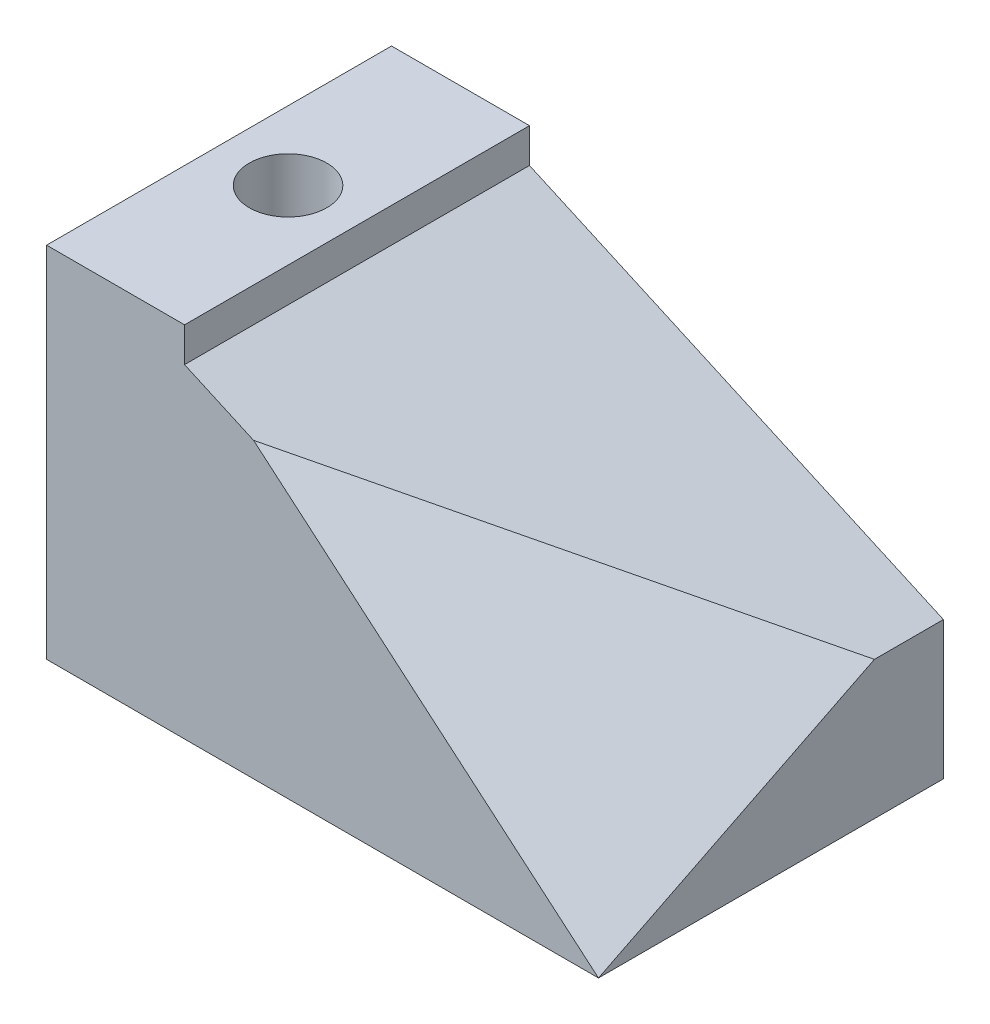
ISO-10303-21;
HEADER;
FILE_DESCRIPTION(('STEP AP214'),'2;1');
FILE_NAME('part.step','',(''),(''),'','','');
FILE_SCHEMA(('AUTOMOTIVE_DESIGN { 1 0 10303 214 1 1 1 1 }'));
ENDSEC;
DATA;
#1=APPLICATION_CONTEXT('core data for automotive mechanical design processes');
#2=APPLICATION_PROTOCOL_DEFINITION('international standard','automotive_design',2000,#1);
#3=PRODUCT_CONTEXT('',#1,'mechanical');
#4=PRODUCT('Part','Part','',(#3));
#5=PRODUCT_RELATED_PRODUCT_CATEGORY('part','',(#4));
#6=PRODUCT_DEFINITION_FORMATION('','',#4);
#7=PRODUCT_DEFINITION_CONTEXT('part definition',#1,'design');
#8=PRODUCT_DEFINITION('design','',#6,#7);
#9=PRODUCT_DEFINITION_SHAPE('','',#8);
#10=(LENGTH_UNIT() NAMED_UNIT(*) SI_UNIT(.MILLI.,.METRE.));
#11=(NAMED_UNIT(*) PLANE_ANGLE_UNIT() SI_UNIT($,.RADIAN.));
#12=(NAMED_UNIT(*) SI_UNIT($,.STERADIAN.) SOLID_ANGLE_UNIT());
#13=UNCERTAINTY_MEASURE_WITH_UNIT(LENGTH_MEASURE(1.E-05),#10,'distance_accuracy_value','');
#14=(GEOMETRIC_REPRESENTATION_CONTEXT(3) GLOBAL_UNCERTAINTY_ASSIGNED_CONTEXT((#13)) GLOBAL_UNIT_ASSIGNED_CONTEXT((#10,
#11,#12)) REPRESENTATION_CONTEXT('',''));
#15=CARTESIAN_POINT('',(0.,0.,0.));
#16=DIRECTION('',(0.,0.,1.));
#17=DIRECTION('',(1.,0.,0.));
#18=AXIS2_PLACEMENT_3D('',#15,#16,#17);
#19=CARTESIAN_POINT('',(400.,-260.,125.));
#20=DIRECTION('',(-1.,0.,0.));
#21=DIRECTION('',(0.,0.,1.));
#22=AXIS2_PLACEMENT_3D('',#19,#20,#21);
#23=PLANE('',#22);
#24=DIRECTION('',(0.,-0.447213595499958,0.894427190999916));
#25=VECTOR('',#24,1.);
#26=CARTESIAN_POINT('',(400.,-160.,-75.));
#27=LINE('',#26,#25);
#28=CARTESIAN_POINT('',(400.,-160.,-75.));
#29=VERTEX_POINT('',#28);
#30=CARTESIAN_POINT('',(400.,-260.,125.));
#31=VERTEX_POINT('',#30);
#32=EDGE_CURVE('E138',#29,#31,#27,.T.);
#33=ORIENTED_EDGE('',*,*,#32,.T.);
#34=DIRECTION('',(0.,0.,-1.));
#35=VECTOR('',#34,1.);
#36=CARTESIAN_POINT('',(400.,-260.,125.));
#37=LINE('',#36,#35);
#38=CARTESIAN_POINT('',(400.,-260.,-125.));
#39=VERTEX_POINT('',#38);
#40=EDGE_CURVE('E149',#31,#39,#37,.T.);
#41=ORIENTED_EDGE('',*,*,#40,.T.);
#42=DIRECTION('',(0.,1.,0.));
#43=VECTOR('',#42,1.);
#44=CARTESIAN_POINT('',(400.,-260.,-125.));
#45=LINE('',#44,#43);
#46=CARTESIAN_POINT('',(400.,-160.,-125.));
#47=VERTEX_POINT('',#46);
#48=EDGE_CURVE('E190',#39,#47,#45,.T.);
#49=ORIENTED_EDGE('',*,*,#48,.T.);
#50=DIRECTION('',(0.,0.,-1.));
#51=VECTOR('',#50,1.);
#52=CARTESIAN_POINT('',(400.,-160.,125.));
#53=LINE('',#52,#51);
#54=EDGE_CURVE('E151',#29,#47,#53,.T.);
#55=ORIENTED_EDGE('',*,*,#54,.F.);
#56=EDGE_LOOP('',(#33,#41,#49,#55));
#57=FACE_BOUND('',#56,.T.);
#58=ADVANCED_FACE('F70',(#57),#23,.F.);
#59=CARTESIAN_POINT('',(400.,-160.,125.));
#60=DIRECTION('',(-0.410364677328798,-0.911921505175107,0.));
#61=DIRECTION('',(0.911921505175107,-0.410364677328798,0.));
#62=AXIS2_PLACEMENT_3D('',#59,#60,#61);
#63=PLANE('',#62);
#64=DIRECTION('',(0.736709468683757,-0.331519260907691,-0.589367574947006));
#65=VECTOR('',#64,1.);
#66=CARTESIAN_POINT('',(150.,-47.5,125.));
#67=LINE('',#66,#65);
#68=CARTESIAN_POINT('',(150.,-47.5,125.));
#69=VERTEX_POINT('',#68);
#70=EDGE_CURVE('E88',#69,#29,#67,.T.);
#71=ORIENTED_EDGE('',*,*,#70,.T.);
#72=ORIENTED_EDGE('',*,*,#54,.T.);
#73=DIRECTION('',(-0.911921505175106,0.410364677328798,0.));
#74=VECTOR('',#73,1.);
#75=CARTESIAN_POINT('',(400.,-160.,-125.));
#76=LINE('',#75,#74);
#77=CARTESIAN_POINT('',(100.,-25.,-125.));
#78=VERTEX_POINT('',#77);
#79=EDGE_CURVE('E187',#47,#78,#76,.T.);
#80=ORIENTED_EDGE('',*,*,#79,.T.);
#81=DIRECTION('',(0.,0.,-1.));
#82=VECTOR('',#81,1.);
#83=CARTESIAN_POINT('',(100.,-25.,125.));
#84=LINE('',#83,#82);
#85=CARTESIAN_POINT('',(100.,-25.,125.));
#86=VERTEX_POINT('',#85);
#87=EDGE_CURVE('E170',#86,#78,#84,.T.);
#88=ORIENTED_EDGE('',*,*,#87,.F.);
#89=DIRECTION('',(-0.911921505175106,0.410364677328798,0.));
#90=VECTOR('',#89,1.);
#91=CARTESIAN_POINT('',(400.,-160.,125.));
#92=LINE('',#91,#90);
#93=EDGE_CURVE('E161',#69,#86,#92,.T.);
#94=ORIENTED_EDGE('',*,*,#93,.F.);
#95=EDGE_LOOP('',(#71,#72,#80,#88,#94));
#96=FACE_BOUND('',#95,.T.);
#97=ADVANCED_FACE('F249',(#96),#63,.F.);
#98=CARTESIAN_POINT('',(0.,0.,125.));
#99=DIRECTION('',(0.,0.,1.));
#100=DIRECTION('',(1.,0.,0.));
#101=AXIS2_PLACEMENT_3D('',#98,#99,#100);
#102=PLANE('',#101);
#103=DIRECTION('',(1.,0.,0.));
#104=VECTOR('',#103,1.);
#105=CARTESIAN_POINT('',(0.,-260.,125.));
#106=LINE('',#105,#104);
#107=CARTESIAN_POINT('',(0.,-260.,125.));
#108=VERTEX_POINT('',#107);
#109=EDGE_CURVE('E156',#108,#31,#106,.T.);
#110=ORIENTED_EDGE('',*,*,#109,.T.);
#111=DIRECTION('',(-0.761939317759459,0.64764842009554,0.));
#112=VECTOR('',#111,1.);
#113=CARTESIAN_POINT('',(400.,-260.,125.));
#114=LINE('',#113,#112);
#115=EDGE_CURVE('E135',#31,#69,#114,.T.);
#116=ORIENTED_EDGE('',*,*,#115,.T.);
#117=ORIENTED_EDGE('',*,*,#93,.T.);
#118=DIRECTION('',(0.,1.,0.));
#119=VECTOR('',#118,1.);
#120=CARTESIAN_POINT('',(100.,-25.,125.));
#121=LINE('',#120,#119);
#122=CARTESIAN_POINT('',(100.,0.,125.));
#123=VERTEX_POINT('',#122);
#124=EDGE_CURVE('E97',#86,#123,#121,.T.);
#125=ORIENTED_EDGE('',*,*,#124,.T.);
#126=DIRECTION('',(-1.,0.,0.));
#127=VECTOR('',#126,1.);
#128=CARTESIAN_POINT('',(100.,0.,125.));
#129=LINE('',#128,#127);
#130=CARTESIAN_POINT('',(0.,0.,125.));
#131=VERTEX_POINT('',#130);
#132=EDGE_CURVE('E186',#123,#131,#129,.T.);
#133=ORIENTED_EDGE('',*,*,#132,.T.);
#134=DIRECTION('',(0.,-1.,0.));
#135=VECTOR('',#134,1.);
#136=CARTESIAN_POINT('',(0.,0.,125.));
#137=LINE('',#136,#135);
#138=EDGE_CURVE('E131',#131,#108,#137,.T.);
#139=ORIENTED_EDGE('',*,*,#138,.T.);
#140=EDGE_LOOP('',(#110,#116,#117,#125,#133,#139));
#141=FACE_BOUND('',#140,.T.);
#142=ADVANCED_FACE('F157',(#141),#102,.T.);
#143=CARTESIAN_POINT('',(100.,0.,125.));
#144=DIRECTION('',(0.,-1.,0.));
#145=DIRECTION('',(1.,0.,0.));
#146=AXIS2_PLACEMENT_3D('',#143,#144,#145);
#147=PLANE('',#146);
#148=CARTESIAN_POINT('',(50.,0.,0.));
#149=DIRECTION('',(0.,1.,0.));
#150=DIRECTION('',(-1.,0.,0.));
#151=AXIS2_PLACEMENT_3D('',#148,#149,#150);
#152=CIRCLE('',#151,28.1);
#153=CARTESIAN_POINT('',(21.9,0.,0.));
#154=VERTEX_POINT('',#153);
#155=EDGE_CURVE('E216',#154,#154,#152,.T.);
#156=ORIENTED_EDGE('',*,*,#155,.F.);
#157=EDGE_LOOP('',(#156));
#158=FACE_BOUND('',#157,.T.);
#159=DIRECTION('',(-1.,0.,0.));
#160=VECTOR('',#159,1.);
#161=CARTESIAN_POINT('',(100.,0.,-125.));
#162=LINE('',#161,#160);
#163=CARTESIAN_POINT('',(100.,0.,-125.));
#164=VERTEX_POINT('',#163);
#165=CARTESIAN_POINT('',(0.,0.,-125.));
#166=VERTEX_POINT('',#165);
#167=EDGE_CURVE('E142',#164,#166,#162,.T.);
#168=ORIENTED_EDGE('',*,*,#167,.T.);
#169=DIRECTION('',(0.,0.,-1.));
#170=VECTOR('',#169,1.);
#171=CARTESIAN_POINT('',(0.,0.,125.));
#172=LINE('',#171,#170);
#173=EDGE_CURVE('E12',#131,#166,#172,.T.);
#174=ORIENTED_EDGE('',*,*,#173,.F.);
#175=ORIENTED_EDGE('',*,*,#132,.F.);
#176=DIRECTION('',(0.,0.,-1.));
#177=VECTOR('',#176,1.);
#178=CARTESIAN_POINT('',(100.,0.,125.));
#179=LINE('',#178,#177);
#180=EDGE_CURVE('E181',#123,#164,#179,.T.);
#181=ORIENTED_EDGE('',*,*,#180,.T.);
#182=EDGE_LOOP('',(#168,#174,#175,#181));
#183=FACE_BOUND('',#182,.T.);
#184=ADVANCED_FACE('F72',(#158,#183),#147,.F.);
#185=CARTESIAN_POINT('',(0.,0.,125.));
#186=DIRECTION('',(1.,0.,0.));
#187=DIRECTION('',(0.,0.,-1.));
#188=AXIS2_PLACEMENT_3D('',#185,#186,#187);
#189=PLANE('',#188);
#190=DIRECTION('',(0.,-1.,0.));
#191=VECTOR('',#190,1.);
#192=CARTESIAN_POINT('',(0.,0.,-125.));
#193=LINE('',#192,#191);
#194=CARTESIAN_POINT('',(0.,-260.,-125.));
#195=VERTEX_POINT('',#194);
#196=EDGE_CURVE('E195',#166,#195,#193,.T.);
#197=ORIENTED_EDGE('',*,*,#196,.T.);
#198=DIRECTION('',(0.,0.,-1.));
#199=VECTOR('',#198,1.);
#200=CARTESIAN_POINT('',(0.,-260.,125.));
#201=LINE('',#200,#199);
#202=EDGE_CURVE('E80',#108,#195,#201,.T.);
#203=ORIENTED_EDGE('',*,*,#202,.F.);
#204=ORIENTED_EDGE('',*,*,#138,.F.);
#205=ORIENTED_EDGE('',*,*,#173,.T.);
#206=EDGE_LOOP('',(#197,#203,#204,#205));
#207=FACE_BOUND('',#206,.T.);
#208=ADVANCED_FACE('F234',(#207),#189,.F.);
#209=CARTESIAN_POINT('',(0.,-260.,125.));
#210=DIRECTION('',(0.,1.,0.));
#211=DIRECTION('',(0.,0.,1.));
#212=AXIS2_PLACEMENT_3D('',#209,#210,#211);
#213=PLANE('',#212);
#214=DIRECTION('',(1.,0.,0.));
#215=VECTOR('',#214,1.);
#216=CARTESIAN_POINT('',(0.,-260.,-125.));
#217=LINE('',#216,#215);
#218=EDGE_CURVE('E165',#195,#39,#217,.T.);
#219=ORIENTED_EDGE('',*,*,#218,.T.);
#220=ORIENTED_EDGE('',*,*,#40,.F.);
#221=ORIENTED_EDGE('',*,*,#109,.F.);
#222=ORIENTED_EDGE('',*,*,#202,.T.);
#223=EDGE_LOOP('',(#219,#220,#221,#222));
#224=FACE_BOUND('',#223,.T.);
#225=ADVANCED_FACE('F163',(#224),#213,.F.);
#226=CARTESIAN_POINT('',(100.,-25.,125.));
#227=DIRECTION('',(-1.,0.,0.));
#228=DIRECTION('',(0.,0.,1.));
#229=AXIS2_PLACEMENT_3D('',#226,#227,#228);
#230=PLANE('',#229);
#231=DIRECTION('',(0.,1.,0.));
#232=VECTOR('',#231,1.);
#233=CARTESIAN_POINT('',(100.,-25.,-125.));
#234=LINE('',#233,#232);
#235=EDGE_CURVE('E124',#78,#164,#234,.T.);
#236=ORIENTED_EDGE('',*,*,#235,.T.);
#237=ORIENTED_EDGE('',*,*,#180,.F.);
#238=ORIENTED_EDGE('',*,*,#124,.F.);
#239=ORIENTED_EDGE('',*,*,#87,.T.);
#240=EDGE_LOOP('',(#236,#237,#238,#239));
#241=FACE_BOUND('',#240,.T.);
#242=ADVANCED_FACE('F246',(#241),#230,.F.);
#243=CARTESIAN_POINT('',(0.,0.,-125.));
#244=DIRECTION('',(0.,0.,1.));
#245=DIRECTION('',(1.,0.,0.));
#246=AXIS2_PLACEMENT_3D('',#243,#244,#245);
#247=PLANE('',#246);
#248=ORIENTED_EDGE('',*,*,#167,.F.);
#249=ORIENTED_EDGE('',*,*,#235,.F.);
#250=ORIENTED_EDGE('',*,*,#79,.F.);
#251=ORIENTED_EDGE('',*,*,#48,.F.);
#252=ORIENTED_EDGE('',*,*,#218,.F.);
#253=ORIENTED_EDGE('',*,*,#196,.F.);
#254=EDGE_LOOP('',(#248,#249,#250,#251,#252,#253));
#255=FACE_BOUND('',#254,.T.);
#256=ADVANCED_FACE('F239',(#255),#247,.F.);
#257=CARTESIAN_POINT('',(61.406844106464,72.2433460076047,36.1216730038024));
#258=DIRECTION('',(0.605216026332569,0.712018854508904,0.356009427254453));
#259=DIRECTION('',(-0.761939317759459,0.647648420095541,0.));
#260=AXIS2_PLACEMENT_3D('',#257,#258,#259);
#261=PLANE('',#260);
#262=ORIENTED_EDGE('',*,*,#115,.F.);
#263=ORIENTED_EDGE('',*,*,#32,.F.);
#264=ORIENTED_EDGE('',*,*,#70,.F.);
#265=EDGE_LOOP('',(#262,#263,#264));
#266=FACE_BOUND('',#265,.T.);
#267=ADVANCED_FACE('F137',(#266),#261,.T.);
#268=CARTESIAN_POINT('',(50.,-150.,0.));
#269=DIRECTION('',(0.,1.,0.));
#270=DIRECTION('',(-1.,0.,0.));
#271=AXIS2_PLACEMENT_3D('',#268,#269,#270);
#272=CYLINDRICAL_SURFACE('',#271,28.1);
#273=CARTESIAN_POINT('',(50.,-150.,0.));
#274=DIRECTION('',(0.,1.,0.));
#275=DIRECTION('',(-1.,0.,0.));
#276=AXIS2_PLACEMENT_3D('',#273,#274,#275);
#277=CIRCLE('',#276,28.1);
#278=CARTESIAN_POINT('',(21.9,-150.,0.));
#279=VERTEX_POINT('',#278);
#280=EDGE_CURVE('E153',#279,#279,#277,.T.);
#281=ORIENTED_EDGE('',*,*,#280,.F.);
#282=EDGE_LOOP('',(#281));
#283=FACE_BOUND('',#282,.T.);
#284=ORIENTED_EDGE('',*,*,#155,.T.);
#285=EDGE_LOOP('',(#284));
#286=FACE_BOUND('',#285,.T.);
#287=ADVANCED_FACE('F226',(#283,#286),#272,.F.);
#288=CARTESIAN_POINT('',(50.,-150.,0.));
#289=DIRECTION('',(0.,1.,0.));
#290=DIRECTION('',(-1.,0.,0.));
#291=AXIS2_PLACEMENT_3D('',#288,#289,#290);
#292=PLANE('',#291);
#293=ORIENTED_EDGE('',*,*,#280,.T.);
#294=EDGE_LOOP('',(#293));
#295=FACE_BOUND('',#294,.T.);
#296=ADVANCED_FACE('F224',(#295),#292,.T.);
#297=CLOSED_SHELL('',(#58,#97,#142,#184,#208,#225,#242,#256,#267,#287,#296));
#298=MANIFOLD_SOLID_BREP('B2',#297);
#299=ADVANCED_BREP_SHAPE_REPRESENTATION('',(#18,#298),#14);
#300=SHAPE_DEFINITION_REPRESENTATION(#9,#299);
ENDSEC;
END-ISO-10303-21;
